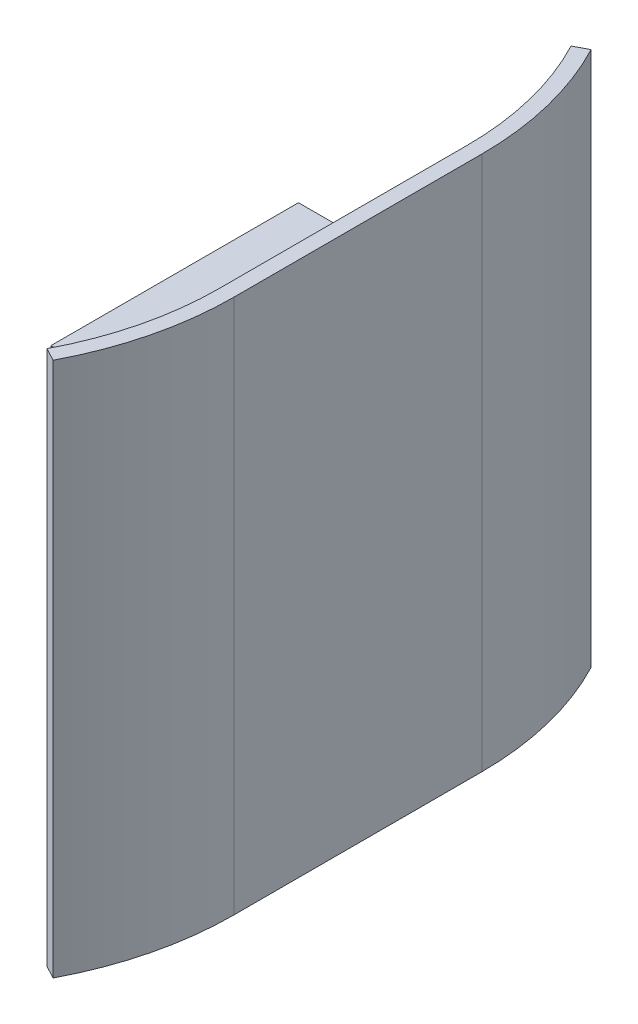
ISO-10303-21;
HEADER;
FILE_DESCRIPTION(('STEP AP214'),'2;1');
FILE_NAME('part.step','',(''),(''),'','','');
FILE_SCHEMA(('AUTOMOTIVE_DESIGN { 1 0 10303 214 1 1 1 1 }'));
ENDSEC;
DATA;
#1=APPLICATION_CONTEXT('core data for automotive mechanical design processes');
#2=APPLICATION_PROTOCOL_DEFINITION('international standard','automotive_design',2000,#1);
#3=PRODUCT_CONTEXT('',#1,'mechanical');
#4=PRODUCT('Part','Part','',(#3));
#5=PRODUCT_RELATED_PRODUCT_CATEGORY('part','',(#4));
#6=PRODUCT_DEFINITION_FORMATION('','',#4);
#7=PRODUCT_DEFINITION_CONTEXT('part definition',#1,'design');
#8=PRODUCT_DEFINITION('design','',#6,#7);
#9=PRODUCT_DEFINITION_SHAPE('','',#8);
#10=(LENGTH_UNIT() NAMED_UNIT(*) SI_UNIT(.MILLI.,.METRE.));
#11=(NAMED_UNIT(*) PLANE_ANGLE_UNIT() SI_UNIT($,.RADIAN.));
#12=(NAMED_UNIT(*) SI_UNIT($,.STERADIAN.) SOLID_ANGLE_UNIT());
#13=UNCERTAINTY_MEASURE_WITH_UNIT(LENGTH_MEASURE(1.E-05),#10,'distance_accuracy_value','');
#14=(GEOMETRIC_REPRESENTATION_CONTEXT(3) GLOBAL_UNCERTAINTY_ASSIGNED_CONTEXT((#13)) GLOBAL_UNIT_ASSIGNED_CONTEXT((#10,
#11,#12)) REPRESENTATION_CONTEXT('',''));
#15=CARTESIAN_POINT('',(0.,0.,0.));
#16=DIRECTION('',(0.,0.,1.));
#17=DIRECTION('',(1.,0.,0.));
#18=AXIS2_PLACEMENT_3D('',#15,#16,#17);
#19=CARTESIAN_POINT('',(0.,0.,50.));
#20=DIRECTION('',(0.,0.,1.));
#21=DIRECTION('',(1.,0.,0.));
#22=AXIS2_PLACEMENT_3D('',#19,#20,#21);
#23=PLANE('',#22);
#24=DIRECTION('',(0.,-1.,0.));
#25=VECTOR('',#24,1.);
#26=CARTESIAN_POINT('',(-2.,0.,50.));
#27=LINE('',#26,#25);
#28=CARTESIAN_POINT('',(-2.,52.,50.));
#29=VERTEX_POINT('',#28);
#30=CARTESIAN_POINT('',(-2.,-2.,50.));
#31=VERTEX_POINT('',#30);
#32=EDGE_CURVE('E310',#29,#31,#27,.T.);
#33=ORIENTED_EDGE('',*,*,#32,.T.);
#34=DIRECTION('',(1.,0.,0.));
#35=VECTOR('',#34,1.);
#36=CARTESIAN_POINT('',(0.,-2.,50.));
#37=LINE('',#36,#35);
#38=CARTESIAN_POINT('',(32.,-2.,50.));
#39=VERTEX_POINT('',#38);
#40=EDGE_CURVE('E313',#31,#39,#37,.T.);
#41=ORIENTED_EDGE('',*,*,#40,.T.);
#42=DIRECTION('',(0.,1.,0.));
#43=VECTOR('',#42,1.);
#44=CARTESIAN_POINT('',(32.,0.,50.));
#45=LINE('',#44,#43);
#46=CARTESIAN_POINT('',(32.,52.,50.));
#47=VERTEX_POINT('',#46);
#48=EDGE_CURVE('E180',#39,#47,#45,.T.);
#49=ORIENTED_EDGE('',*,*,#48,.T.);
#50=DIRECTION('',(-1.,0.,0.));
#51=VECTOR('',#50,1.);
#52=CARTESIAN_POINT('',(0.,52.,50.));
#53=LINE('',#52,#51);
#54=EDGE_CURVE('E317',#47,#29,#53,.T.);
#55=ORIENTED_EDGE('',*,*,#54,.T.);
#56=EDGE_LOOP('',(#33,#41,#49,#55));
#57=FACE_BOUND('',#56,.T.);
#58=DIRECTION('',(1.,0.,0.));
#59=VECTOR('',#58,1.);
#60=CARTESIAN_POINT('',(0.,0.,50.));
#61=LINE('',#60,#59);
#62=CARTESIAN_POINT('',(0.,0.,50.));
#63=VERTEX_POINT('',#62);
#64=CARTESIAN_POINT('',(30.,0.,50.));
#65=VERTEX_POINT('',#64);
#66=EDGE_CURVE('E286',#63,#65,#61,.T.);
#67=ORIENTED_EDGE('',*,*,#66,.F.);
#68=DIRECTION('',(0.,-1.,0.));
#69=VECTOR('',#68,1.);
#70=CARTESIAN_POINT('',(0.,0.,50.));
#71=LINE('',#70,#69);
#72=CARTESIAN_POINT('',(0.,50.,50.));
#73=VERTEX_POINT('',#72);
#74=EDGE_CURVE('E284',#73,#63,#71,.T.);
#75=ORIENTED_EDGE('',*,*,#74,.F.);
#76=DIRECTION('',(-1.,0.,0.));
#77=VECTOR('',#76,1.);
#78=CARTESIAN_POINT('',(0.,50.,50.));
#79=LINE('',#78,#77);
#80=CARTESIAN_POINT('',(30.,50.,50.));
#81=VERTEX_POINT('',#80);
#82=EDGE_CURVE('E291',#81,#73,#79,.T.);
#83=ORIENTED_EDGE('',*,*,#82,.F.);
#84=DIRECTION('',(0.,1.,0.));
#85=VECTOR('',#84,1.);
#86=CARTESIAN_POINT('',(30.,0.,50.));
#87=LINE('',#86,#85);
#88=EDGE_CURVE('E289',#65,#81,#87,.T.);
#89=ORIENTED_EDGE('',*,*,#88,.F.);
#90=EDGE_LOOP('',(#67,#75,#83,#89));
#91=FACE_BOUND('',#90,.T.);
#92=ADVANCED_FACE('F57',(#57,#91),#23,.T.);
#93=CARTESIAN_POINT('',(0.,0.,0.));
#94=DIRECTION('',(0.,0.,1.));
#95=DIRECTION('',(1.,0.,0.));
#96=AXIS2_PLACEMENT_3D('',#93,#94,#95);
#97=PLANE('',#96);
#98=DIRECTION('',(0.,-1.,0.));
#99=VECTOR('',#98,1.);
#100=CARTESIAN_POINT('',(-2.,0.,0.));
#101=LINE('',#100,#99);
#102=CARTESIAN_POINT('',(-2.,52.,0.));
#103=VERTEX_POINT('',#102);
#104=CARTESIAN_POINT('',(-2.,-2.,0.));
#105=VERTEX_POINT('',#104);
#106=EDGE_CURVE('E309',#103,#105,#101,.T.);
#107=ORIENTED_EDGE('',*,*,#106,.F.);
#108=DIRECTION('',(-1.,0.,0.));
#109=VECTOR('',#108,1.);
#110=CARTESIAN_POINT('',(0.,52.,0.));
#111=LINE('',#110,#109);
#112=CARTESIAN_POINT('',(32.,52.,0.));
#113=VERTEX_POINT('',#112);
#114=EDGE_CURVE('E314',#113,#103,#111,.T.);
#115=ORIENTED_EDGE('',*,*,#114,.F.);
#116=DIRECTION('',(0.,1.,0.));
#117=VECTOR('',#116,1.);
#118=CARTESIAN_POINT('',(32.,0.,0.));
#119=LINE('',#118,#117);
#120=CARTESIAN_POINT('',(32.,-2.,0.));
#121=VERTEX_POINT('',#120);
#122=EDGE_CURVE('E325',#121,#113,#119,.T.);
#123=ORIENTED_EDGE('',*,*,#122,.F.);
#124=DIRECTION('',(1.,0.,0.));
#125=VECTOR('',#124,1.);
#126=CARTESIAN_POINT('',(0.,-2.,0.));
#127=LINE('',#126,#125);
#128=EDGE_CURVE('E322',#105,#121,#127,.T.);
#129=ORIENTED_EDGE('',*,*,#128,.F.);
#130=EDGE_LOOP('',(#107,#115,#123,#129));
#131=FACE_BOUND('',#130,.T.);
#132=DIRECTION('',(0.,-1.,0.));
#133=VECTOR('',#132,1.);
#134=CARTESIAN_POINT('',(0.,0.,0.));
#135=LINE('',#134,#133);
#136=CARTESIAN_POINT('',(0.,50.,0.));
#137=VERTEX_POINT('',#136);
#138=CARTESIAN_POINT('',(0.,0.,0.));
#139=VERTEX_POINT('',#138);
#140=EDGE_CURVE('E80',#137,#139,#135,.T.);
#141=ORIENTED_EDGE('',*,*,#140,.T.);
#142=DIRECTION('',(1.,0.,0.));
#143=VECTOR('',#142,1.);
#144=CARTESIAN_POINT('',(0.,0.,0.));
#145=LINE('',#144,#143);
#146=CARTESIAN_POINT('',(30.,0.,0.));
#147=VERTEX_POINT('',#146);
#148=EDGE_CURVE('E295',#139,#147,#145,.T.);
#149=ORIENTED_EDGE('',*,*,#148,.T.);
#150=DIRECTION('',(0.,1.,0.));
#151=VECTOR('',#150,1.);
#152=CARTESIAN_POINT('',(30.,0.,0.));
#153=LINE('',#152,#151);
#154=CARTESIAN_POINT('',(30.,50.,0.));
#155=VERTEX_POINT('',#154);
#156=EDGE_CURVE('E298',#147,#155,#153,.T.);
#157=ORIENTED_EDGE('',*,*,#156,.T.);
#158=DIRECTION('',(-1.,0.,0.));
#159=VECTOR('',#158,1.);
#160=CARTESIAN_POINT('',(0.,50.,0.));
#161=LINE('',#160,#159);
#162=EDGE_CURVE('E287',#155,#137,#161,.T.);
#163=ORIENTED_EDGE('',*,*,#162,.T.);
#164=EDGE_LOOP('',(#141,#149,#157,#163));
#165=FACE_BOUND('',#164,.T.);
#166=ADVANCED_FACE('F344',(#131,#165),#97,.F.);
#167=CARTESIAN_POINT('',(-2.,0.,50.));
#168=DIRECTION('',(1.,0.,0.));
#169=DIRECTION('',(0.,0.,-1.));
#170=AXIS2_PLACEMENT_3D('',#167,#168,#169);
#171=PLANE('',#170);
#172=CARTESIAN_POINT('',(-2.,17.,25.));
#173=DIRECTION('',(-1.,0.,0.));
#174=DIRECTION('',(0.,0.,-1.));
#175=AXIS2_PLACEMENT_3D('',#172,#173,#174);
#176=CIRCLE('',#175,2.);
#177=CARTESIAN_POINT('',(-2.,17.,23.));
#178=VERTEX_POINT('',#177);
#179=EDGE_CURVE('E259',#178,#178,#176,.T.);
#180=ORIENTED_EDGE('',*,*,#179,.F.);
#181=EDGE_LOOP('',(#180));
#182=FACE_BOUND('',#181,.T.);
#183=CARTESIAN_POINT('',(-2.,33.,25.));
#184=DIRECTION('',(-1.,0.,0.));
#185=DIRECTION('',(0.,0.,1.));
#186=AXIS2_PLACEMENT_3D('',#183,#184,#185);
#187=CIRCLE('',#186,2.);
#188=CARTESIAN_POINT('',(-2.,33.,27.));
#189=VERTEX_POINT('',#188);
#190=EDGE_CURVE('E258',#189,#189,#187,.T.);
#191=ORIENTED_EDGE('',*,*,#190,.F.);
#192=EDGE_LOOP('',(#191));
#193=FACE_BOUND('',#192,.T.);
#194=CARTESIAN_POINT('',(-2.,25.,17.));
#195=DIRECTION('',(-1.,0.,0.));
#196=DIRECTION('',(0.,0.,-1.));
#197=AXIS2_PLACEMENT_3D('',#194,#195,#196);
#198=CIRCLE('',#197,2.);
#199=CARTESIAN_POINT('',(-2.,25.,15.));
#200=VERTEX_POINT('',#199);
#201=EDGE_CURVE('E271',#200,#200,#198,.T.);
#202=ORIENTED_EDGE('',*,*,#201,.F.);
#203=EDGE_LOOP('',(#202));
#204=FACE_BOUND('',#203,.T.);
#205=CARTESIAN_POINT('',(-2.,25.,33.));
#206=DIRECTION('',(-1.,0.,0.));
#207=DIRECTION('',(0.,0.,1.));
#208=AXIS2_PLACEMENT_3D('',#205,#206,#207);
#209=CIRCLE('',#208,2.);
#210=CARTESIAN_POINT('',(-2.,25.,35.));
#211=VERTEX_POINT('',#210);
#212=EDGE_CURVE('E270',#211,#211,#209,.T.);
#213=ORIENTED_EDGE('',*,*,#212,.F.);
#214=EDGE_LOOP('',(#213));
#215=FACE_BOUND('',#214,.T.);
#216=CARTESIAN_POINT('',(-2.,25.,25.));
#217=DIRECTION('',(-1.,0.,0.));
#218=DIRECTION('',(0.,0.,1.));
#219=AXIS2_PLACEMENT_3D('',#216,#217,#218);
#220=CIRCLE('',#219,4.);
#221=CARTESIAN_POINT('',(-2.,25.,29.));
#222=VERTEX_POINT('',#221);
#223=EDGE_CURVE('E281',#222,#222,#220,.T.);
#224=ORIENTED_EDGE('',*,*,#223,.F.);
#225=EDGE_LOOP('',(#224));
#226=FACE_BOUND('',#225,.T.);
#227=ORIENTED_EDGE('',*,*,#106,.T.);
#228=DIRECTION('',(0.,0.,-1.));
#229=VECTOR('',#228,1.);
#230=CARTESIAN_POINT('',(-2.,-2.,50.));
#231=LINE('',#230,#229);
#232=EDGE_CURVE('E12',#31,#105,#231,.T.);
#233=ORIENTED_EDGE('',*,*,#232,.F.);
#234=ORIENTED_EDGE('',*,*,#32,.F.);
#235=DIRECTION('',(0.,0.,-1.));
#236=VECTOR('',#235,1.);
#237=CARTESIAN_POINT('',(-2.,52.,50.));
#238=LINE('',#237,#236);
#239=EDGE_CURVE('E319',#29,#103,#238,.T.);
#240=ORIENTED_EDGE('',*,*,#239,.T.);
#241=EDGE_LOOP('',(#227,#233,#234,#240));
#242=FACE_BOUND('',#241,.T.);
#243=ADVANCED_FACE('F59',(#182,#193,#204,#215,#226,#242),#171,.F.);
#244=CARTESIAN_POINT('',(0.,-2.,50.));
#245=DIRECTION('',(0.,1.,0.));
#246=DIRECTION('',(0.,0.,1.));
#247=AXIS2_PLACEMENT_3D('',#244,#245,#246);
#248=PLANE('',#247);
#249=ORIENTED_EDGE('',*,*,#128,.T.);
#250=DIRECTION('',(0.,0.,-1.));
#251=VECTOR('',#250,1.);
#252=CARTESIAN_POINT('',(32.,-2.,50.));
#253=LINE('',#252,#251);
#254=EDGE_CURVE('E65',#39,#121,#253,.T.);
#255=ORIENTED_EDGE('',*,*,#254,.F.);
#256=ORIENTED_EDGE('',*,*,#40,.F.);
#257=ORIENTED_EDGE('',*,*,#232,.T.);
#258=EDGE_LOOP('',(#249,#255,#256,#257));
#259=FACE_BOUND('',#258,.T.);
#260=ADVANCED_FACE('F339',(#259),#248,.F.);
#261=CARTESIAN_POINT('',(0.,52.,50.));
#262=DIRECTION('',(0.,-1.,0.));
#263=DIRECTION('',(0.,0.,-1.));
#264=AXIS2_PLACEMENT_3D('',#261,#262,#263);
#265=PLANE('',#264);
#266=ORIENTED_EDGE('',*,*,#114,.T.);
#267=ORIENTED_EDGE('',*,*,#239,.F.);
#268=ORIENTED_EDGE('',*,*,#54,.F.);
#269=DIRECTION('',(0.,0.,-1.));
#270=VECTOR('',#269,1.);
#271=CARTESIAN_POINT('',(32.,52.,50.));
#272=LINE('',#271,#270);
#273=EDGE_CURVE('E330',#47,#113,#272,.T.);
#274=ORIENTED_EDGE('',*,*,#273,.T.);
#275=EDGE_LOOP('',(#266,#267,#268,#274));
#276=FACE_BOUND('',#275,.T.);
#277=ADVANCED_FACE('F348',(#276),#265,.F.);
#278=CARTESIAN_POINT('',(0.,0.,50.));
#279=DIRECTION('',(1.,0.,0.));
#280=DIRECTION('',(0.,0.,-1.));
#281=AXIS2_PLACEMENT_3D('',#278,#279,#280);
#282=PLANE('',#281);
#283=CARTESIAN_POINT('',(0.,17.,25.));
#284=DIRECTION('',(1.,0.,0.));
#285=DIRECTION('',(0.,0.,-1.));
#286=AXIS2_PLACEMENT_3D('',#283,#284,#285);
#287=CIRCLE('',#286,2.);
#288=CARTESIAN_POINT('',(0.,17.,23.));
#289=VERTEX_POINT('',#288);
#290=EDGE_CURVE('E237',#289,#289,#287,.F.);
#291=ORIENTED_EDGE('',*,*,#290,.T.);
#292=EDGE_LOOP('',(#291));
#293=FACE_BOUND('',#292,.T.);
#294=CARTESIAN_POINT('',(0.,33.,25.));
#295=DIRECTION('',(1.,0.,0.));
#296=DIRECTION('',(0.,0.,-1.));
#297=AXIS2_PLACEMENT_3D('',#294,#295,#296);
#298=CIRCLE('',#297,2.);
#299=CARTESIAN_POINT('',(0.,33.,23.));
#300=VERTEX_POINT('',#299);
#301=EDGE_CURVE('E255',#300,#300,#298,.F.);
#302=ORIENTED_EDGE('',*,*,#301,.T.);
#303=EDGE_LOOP('',(#302));
#304=FACE_BOUND('',#303,.T.);
#305=CARTESIAN_POINT('',(0.,25.,17.));
#306=DIRECTION('',(1.,0.,0.));
#307=DIRECTION('',(0.,0.,-1.));
#308=AXIS2_PLACEMENT_3D('',#305,#306,#307);
#309=CIRCLE('',#308,2.);
#310=CARTESIAN_POINT('',(0.,25.,15.));
#311=VERTEX_POINT('',#310);
#312=EDGE_CURVE('E262',#311,#311,#309,.F.);
#313=ORIENTED_EDGE('',*,*,#312,.T.);
#314=EDGE_LOOP('',(#313));
#315=FACE_BOUND('',#314,.T.);
#316=CARTESIAN_POINT('',(0.,25.,33.));
#317=DIRECTION('',(1.,0.,0.));
#318=DIRECTION('',(0.,0.,-1.));
#319=AXIS2_PLACEMENT_3D('',#316,#317,#318);
#320=CIRCLE('',#319,2.);
#321=CARTESIAN_POINT('',(0.,25.,31.));
#322=VERTEX_POINT('',#321);
#323=EDGE_CURVE('E267',#322,#322,#320,.F.);
#324=ORIENTED_EDGE('',*,*,#323,.T.);
#325=EDGE_LOOP('',(#324));
#326=FACE_BOUND('',#325,.T.);
#327=CARTESIAN_POINT('',(0.,25.,25.));
#328=DIRECTION('',(1.,0.,0.));
#329=DIRECTION('',(0.,0.,-1.));
#330=AXIS2_PLACEMENT_3D('',#327,#328,#329);
#331=CIRCLE('',#330,4.);
#332=CARTESIAN_POINT('',(0.,25.,21.));
#333=VERTEX_POINT('',#332);
#334=EDGE_CURVE('E274',#333,#333,#331,.F.);
#335=ORIENTED_EDGE('',*,*,#334,.T.);
#336=EDGE_LOOP('',(#335));
#337=FACE_BOUND('',#336,.T.);
#338=ORIENTED_EDGE('',*,*,#140,.F.);
#339=DIRECTION('',(0.,0.,-1.));
#340=VECTOR('',#339,1.);
#341=CARTESIAN_POINT('',(0.,50.,50.));
#342=LINE('',#341,#340);
#343=EDGE_CURVE('E293',#73,#137,#342,.T.);
#344=ORIENTED_EDGE('',*,*,#343,.F.);
#345=ORIENTED_EDGE('',*,*,#74,.T.);
#346=DIRECTION('',(0.,0.,-1.));
#347=VECTOR('',#346,1.);
#348=CARTESIAN_POINT('',(0.,0.,50.));
#349=LINE('',#348,#347);
#350=EDGE_CURVE('E307',#63,#139,#349,.T.);
#351=ORIENTED_EDGE('',*,*,#350,.T.);
#352=EDGE_LOOP('',(#338,#344,#345,#351));
#353=FACE_BOUND('',#352,.T.);
#354=ADVANCED_FACE('F395',(#293,#304,#315,#326,#337,#353),#282,.T.);
#355=CARTESIAN_POINT('',(0.,0.,50.));
#356=DIRECTION('',(0.,1.,0.));
#357=DIRECTION('',(0.,0.,1.));
#358=AXIS2_PLACEMENT_3D('',#355,#356,#357);
#359=PLANE('',#358);
#360=ORIENTED_EDGE('',*,*,#148,.F.);
#361=ORIENTED_EDGE('',*,*,#350,.F.);
#362=ORIENTED_EDGE('',*,*,#66,.T.);
#363=DIRECTION('',(0.,0.,-1.));
#364=VECTOR('',#363,1.);
#365=CARTESIAN_POINT('',(30.,0.,50.));
#366=LINE('',#365,#364);
#367=EDGE_CURVE('E305',#65,#147,#366,.T.);
#368=ORIENTED_EDGE('',*,*,#367,.T.);
#369=EDGE_LOOP('',(#360,#361,#362,#368));
#370=FACE_BOUND('',#369,.T.);
#371=ADVANCED_FACE('F435',(#370),#359,.T.);
#372=CARTESIAN_POINT('',(30.,0.,50.));
#373=DIRECTION('',(-1.,0.,0.));
#374=DIRECTION('',(0.,0.,1.));
#375=AXIS2_PLACEMENT_3D('',#372,#373,#374);
#376=PLANE('',#375);
#377=ORIENTED_EDGE('',*,*,#156,.F.);
#378=ORIENTED_EDGE('',*,*,#367,.F.);
#379=ORIENTED_EDGE('',*,*,#88,.T.);
#380=DIRECTION('',(0.,0.,-1.));
#381=VECTOR('',#380,1.);
#382=CARTESIAN_POINT('',(30.,50.,50.));
#383=LINE('',#382,#381);
#384=EDGE_CURVE('E72',#81,#155,#383,.T.);
#385=ORIENTED_EDGE('',*,*,#384,.T.);
#386=EDGE_LOOP('',(#377,#378,#379,#385));
#387=FACE_BOUND('',#386,.T.);
#388=ADVANCED_FACE('F429',(#387),#376,.T.);
#389=CARTESIAN_POINT('',(0.,50.,50.));
#390=DIRECTION('',(0.,-1.,0.));
#391=DIRECTION('',(0.,0.,-1.));
#392=AXIS2_PLACEMENT_3D('',#389,#390,#391);
#393=PLANE('',#392);
#394=ORIENTED_EDGE('',*,*,#162,.F.);
#395=ORIENTED_EDGE('',*,*,#384,.F.);
#396=ORIENTED_EDGE('',*,*,#82,.T.);
#397=ORIENTED_EDGE('',*,*,#343,.T.);
#398=EDGE_LOOP('',(#394,#395,#396,#397));
#399=FACE_BOUND('',#398,.T.);
#400=ADVANCED_FACE('F419',(#399),#393,.T.);
#401=CARTESIAN_POINT('',(32.001,25.,25.));
#402=DIRECTION('',(-1.,0.,0.));
#403=DIRECTION('',(0.,0.,1.));
#404=AXIS2_PLACEMENT_3D('',#401,#402,#403);
#405=CYLINDRICAL_SURFACE('',#404,4.);
#406=ORIENTED_EDGE('',*,*,#334,.F.);
#407=EDGE_LOOP('',(#406));
#408=FACE_BOUND('',#407,.T.);
#409=ORIENTED_EDGE('',*,*,#223,.T.);
#410=EDGE_LOOP('',(#409));
#411=FACE_BOUND('',#410,.T.);
#412=ADVANCED_FACE('F416',(#408,#411),#405,.F.);
#413=CARTESIAN_POINT('',(32.001,25.,33.));
#414=DIRECTION('',(-1.,0.,0.));
#415=DIRECTION('',(0.,0.,1.));
#416=AXIS2_PLACEMENT_3D('',#413,#414,#415);
#417=CYLINDRICAL_SURFACE('',#416,2.);
#418=ORIENTED_EDGE('',*,*,#323,.F.);
#419=EDGE_LOOP('',(#418));
#420=FACE_BOUND('',#419,.T.);
#421=ORIENTED_EDGE('',*,*,#212,.T.);
#422=EDGE_LOOP('',(#421));
#423=FACE_BOUND('',#422,.T.);
#424=ADVANCED_FACE('F418',(#420,#423),#417,.F.);
#425=CARTESIAN_POINT('',(32.001,25.,17.));
#426=DIRECTION('',(-1.,0.,0.));
#427=DIRECTION('',(0.,0.,1.));
#428=AXIS2_PLACEMENT_3D('',#425,#426,#427);
#429=CYLINDRICAL_SURFACE('',#428,2.);
#430=ORIENTED_EDGE('',*,*,#312,.F.);
#431=EDGE_LOOP('',(#430));
#432=FACE_BOUND('',#431,.T.);
#433=ORIENTED_EDGE('',*,*,#201,.T.);
#434=EDGE_LOOP('',(#433));
#435=FACE_BOUND('',#434,.T.);
#436=ADVANCED_FACE('F426',(#432,#435),#429,.F.);
#437=CARTESIAN_POINT('',(32.001,33.,25.));
#438=DIRECTION('',(-1.,0.,0.));
#439=DIRECTION('',(0.,0.,1.));
#440=AXIS2_PLACEMENT_3D('',#437,#438,#439);
#441=CYLINDRICAL_SURFACE('',#440,2.);
#442=ORIENTED_EDGE('',*,*,#301,.F.);
#443=EDGE_LOOP('',(#442));
#444=FACE_BOUND('',#443,.T.);
#445=ORIENTED_EDGE('',*,*,#190,.T.);
#446=EDGE_LOOP('',(#445));
#447=FACE_BOUND('',#446,.T.);
#448=ADVANCED_FACE('F464',(#444,#447),#441,.F.);
#449=CARTESIAN_POINT('',(32.001,17.,25.));
#450=DIRECTION('',(-1.,0.,0.));
#451=DIRECTION('',(0.,0.,1.));
#452=AXIS2_PLACEMENT_3D('',#449,#450,#451);
#453=CYLINDRICAL_SURFACE('',#452,2.);
#454=ORIENTED_EDGE('',*,*,#290,.F.);
#455=EDGE_LOOP('',(#454));
#456=FACE_BOUND('',#455,.T.);
#457=ORIENTED_EDGE('',*,*,#179,.T.);
#458=EDGE_LOOP('',(#457));
#459=FACE_BOUND('',#458,.T.);
#460=ADVANCED_FACE('F468',(#456,#459),#453,.F.);
#461=CARTESIAN_POINT('',(32.,25.,50.));
#462=DIRECTION('',(-1.,0.,0.));
#463=DIRECTION('',(0.,0.,1.));
#464=AXIS2_PLACEMENT_3D('',#461,#462,#463);
#465=PLANE('',#464);
#466=ORIENTED_EDGE('',*,*,#273,.F.);
#467=DIRECTION('',(0.,1.,0.));
#468=VECTOR('',#467,1.);
#469=CARTESIAN_POINT('',(32.,25.,50.));
#470=LINE('',#469,#468);
#471=CARTESIAN_POINT('',(32.,79.,50.));
#472=VERTEX_POINT('',#471);
#473=EDGE_CURVE('E235',#47,#472,#470,.T.);
#474=ORIENTED_EDGE('',*,*,#473,.T.);
#475=DIRECTION('',(0.,0.,1.));
#476=VECTOR('',#475,1.);
#477=CARTESIAN_POINT('',(32.,79.,50.));
#478=LINE('',#477,#476);
#479=CARTESIAN_POINT('',(32.,79.,0.));
#480=VERTEX_POINT('',#479);
#481=EDGE_CURVE('E231',#480,#472,#478,.T.);
#482=ORIENTED_EDGE('',*,*,#481,.F.);
#483=DIRECTION('',(0.,1.,0.));
#484=VECTOR('',#483,1.);
#485=CARTESIAN_POINT('',(32.,25.,0.));
#486=LINE('',#485,#484);
#487=EDGE_CURVE('E238',#113,#480,#486,.T.);
#488=ORIENTED_EDGE('',*,*,#487,.F.);
#489=EDGE_LOOP('',(#466,#474,#482,#488));
#490=FACE_BOUND('',#489,.T.);
#491=ADVANCED_FACE('F356',(#490),#465,.T.);
#492=CARTESIAN_POINT('',(-28.,25.,50.));
#493=DIRECTION('',(0.,1.,0.));
#494=DIRECTION('',(0.,0.,1.));
#495=AXIS2_PLACEMENT_3D('',#492,#493,#494);
#496=CYLINDRICAL_SURFACE('',#495,60.);
#497=CARTESIAN_POINT('',(-28.,79.,50.));
#498=DIRECTION('',(0.,-1.,0.));
#499=DIRECTION('',(0.,0.,-1.));
#500=AXIS2_PLACEMENT_3D('',#497,#498,#499);
#501=CIRCLE('',#500,60.);
#502=CARTESIAN_POINT('',(25.1181643379453,79.,77.9009071065269));
#503=VERTEX_POINT('',#502);
#504=EDGE_CURVE('E213',#472,#503,#501,.T.);
#505=ORIENTED_EDGE('',*,*,#504,.F.);
#506=ORIENTED_EDGE('',*,*,#473,.F.);
#507=ORIENTED_EDGE('',*,*,#48,.F.);
#508=DIRECTION('',(0.,-1.,0.));
#509=VECTOR('',#508,1.);
#510=CARTESIAN_POINT('',(32.,25.,50.));
#511=LINE('',#510,#509);
#512=CARTESIAN_POINT('',(32.,-29.,50.));
#513=VERTEX_POINT('',#512);
#514=EDGE_CURVE('E172',#39,#513,#511,.T.);
#515=ORIENTED_EDGE('',*,*,#514,.T.);
#516=CARTESIAN_POINT('',(-28.,-29.,50.));
#517=DIRECTION('',(0.,-1.,0.));
#518=DIRECTION('',(0.,0.,-1.));
#519=AXIS2_PLACEMENT_3D('',#516,#517,#518);
#520=CIRCLE('',#519,60.);
#521=CARTESIAN_POINT('',(25.1181643379453,-29.,77.9009071065269));
#522=VERTEX_POINT('',#521);
#523=EDGE_CURVE('E177',#513,#522,#520,.T.);
#524=ORIENTED_EDGE('',*,*,#523,.T.);
#525=DIRECTION('',(0.,1.,0.));
#526=VECTOR('',#525,1.);
#527=CARTESIAN_POINT('',(25.1181643379453,25.,77.9009071065269));
#528=LINE('',#527,#526);
#529=EDGE_CURVE('E234',#522,#503,#528,.T.);
#530=ORIENTED_EDGE('',*,*,#529,.T.);
#531=EDGE_LOOP('',(#505,#506,#507,#515,#524,#530));
#532=FACE_BOUND('',#531,.T.);
#533=ADVANCED_FACE('F175',(#532),#496,.F.);
#534=CARTESIAN_POINT('',(-28.,25.,0.));
#535=DIRECTION('',(0.,1.,0.));
#536=DIRECTION('',(0.,0.,1.));
#537=AXIS2_PLACEMENT_3D('',#534,#535,#536);
#538=CYLINDRICAL_SURFACE('',#537,60.);
#539=CARTESIAN_POINT('',(-28.,79.,0.));
#540=DIRECTION('',(0.,-1.,0.));
#541=DIRECTION('',(0.,0.,1.));
#542=AXIS2_PLACEMENT_3D('',#539,#540,#541);
#543=CIRCLE('',#542,60.);
#544=CARTESIAN_POINT('',(25.1181643379453,79.,-27.9009071065269));
#545=VERTEX_POINT('',#544);
#546=EDGE_CURVE('E228',#545,#480,#543,.T.);
#547=ORIENTED_EDGE('',*,*,#546,.F.);
#548=DIRECTION('',(0.,1.,0.));
#549=VECTOR('',#548,1.);
#550=CARTESIAN_POINT('',(25.1181643379453,25.,-27.9009071065269));
#551=LINE('',#550,#549);
#552=CARTESIAN_POINT('',(25.1181643379453,-29.,-27.9009071065269));
#553=VERTEX_POINT('',#552);
#554=EDGE_CURVE('E240',#553,#545,#551,.T.);
#555=ORIENTED_EDGE('',*,*,#554,.F.);
#556=CARTESIAN_POINT('',(-28.,-29.,0.));
#557=DIRECTION('',(0.,-1.,0.));
#558=DIRECTION('',(0.,0.,1.));
#559=AXIS2_PLACEMENT_3D('',#556,#557,#558);
#560=CIRCLE('',#559,60.);
#561=CARTESIAN_POINT('',(32.,-29.,0.));
#562=VERTEX_POINT('',#561);
#563=EDGE_CURVE('E193',#553,#562,#560,.T.);
#564=ORIENTED_EDGE('',*,*,#563,.T.);
#565=DIRECTION('',(0.,-1.,0.));
#566=VECTOR('',#565,1.);
#567=CARTESIAN_POINT('',(32.,25.,0.));
#568=LINE('',#567,#566);
#569=EDGE_CURVE('E183',#121,#562,#568,.T.);
#570=ORIENTED_EDGE('',*,*,#569,.F.);
#571=ORIENTED_EDGE('',*,*,#122,.T.);
#572=ORIENTED_EDGE('',*,*,#487,.T.);
#573=EDGE_LOOP('',(#547,#555,#564,#570,#571,#572));
#574=FACE_BOUND('',#573,.T.);
#575=ADVANCED_FACE('F336',(#574),#538,.F.);
#576=CARTESIAN_POINT('',(25.1181643379453,25.,-27.9009071065269));
#577=DIRECTION('',(0.465015118442115,0.,0.885302738965754));
#578=DIRECTION('',(0.885302738965754,0.,-0.465015118442115));
#579=AXIS2_PLACEMENT_3D('',#576,#577,#578);
#580=PLANE('',#579);
#581=DIRECTION('',(0.885302738965754,0.,-0.465015118442115));
#582=VECTOR('',#581,1.);
#583=CARTESIAN_POINT('',(25.1181643379453,79.,-27.9009071065269));
#584=LINE('',#583,#582);
#585=CARTESIAN_POINT('',(27.7740725548425,79.,-29.2959524618532));
#586=VERTEX_POINT('',#585);
#587=EDGE_CURVE('E226',#545,#586,#584,.T.);
#588=ORIENTED_EDGE('',*,*,#587,.T.);
#589=DIRECTION('',(0.,1.,0.));
#590=VECTOR('',#589,1.);
#591=CARTESIAN_POINT('',(27.7740725548425,25.,-29.2959524618532));
#592=LINE('',#591,#590);
#593=CARTESIAN_POINT('',(27.7740725548425,-29.,-29.2959524618532));
#594=VERTEX_POINT('',#593);
#595=EDGE_CURVE('E242',#594,#586,#592,.T.);
#596=ORIENTED_EDGE('',*,*,#595,.F.);
#597=DIRECTION('',(0.885302738965754,0.,-0.465015118442115));
#598=VECTOR('',#597,1.);
#599=CARTESIAN_POINT('',(25.1181643379453,-29.,-27.9009071065269));
#600=LINE('',#599,#598);
#601=EDGE_CURVE('E201',#553,#594,#600,.T.);
#602=ORIENTED_EDGE('',*,*,#601,.F.);
#603=ORIENTED_EDGE('',*,*,#554,.T.);
#604=EDGE_LOOP('',(#588,#596,#602,#603));
#605=FACE_BOUND('',#604,.T.);
#606=ADVANCED_FACE('F365',(#605),#580,.F.);
#607=CARTESIAN_POINT('',(-28.,25.,0.));
#608=DIRECTION('',(0.,1.,0.));
#609=DIRECTION('',(0.,0.,1.));
#610=AXIS2_PLACEMENT_3D('',#607,#608,#609);
#611=CYLINDRICAL_SURFACE('',#610,63.);
#612=CARTESIAN_POINT('',(-28.,79.,0.));
#613=DIRECTION('',(0.,1.,0.));
#614=DIRECTION('',(1.,0.,0.));
#615=AXIS2_PLACEMENT_3D('',#612,#613,#614);
#616=CIRCLE('',#615,63.);
#617=CARTESIAN_POINT('',(35.,79.,0.));
#618=VERTEX_POINT('',#617);
#619=EDGE_CURVE('E224',#586,#618,#616,.F.);
#620=ORIENTED_EDGE('',*,*,#619,.T.);
#621=DIRECTION('',(0.,1.,0.));
#622=VECTOR('',#621,1.);
#623=CARTESIAN_POINT('',(35.,25.,0.));
#624=LINE('',#623,#622);
#625=CARTESIAN_POINT('',(35.,-29.,0.));
#626=VERTEX_POINT('',#625);
#627=EDGE_CURVE('E245',#626,#618,#624,.T.);
#628=ORIENTED_EDGE('',*,*,#627,.F.);
#629=CARTESIAN_POINT('',(-28.,-29.,0.));
#630=DIRECTION('',(0.,1.,0.));
#631=DIRECTION('',(1.,0.,0.));
#632=AXIS2_PLACEMENT_3D('',#629,#630,#631);
#633=CIRCLE('',#632,63.);
#634=EDGE_CURVE('E204',#594,#626,#633,.F.);
#635=ORIENTED_EDGE('',*,*,#634,.F.);
#636=ORIENTED_EDGE('',*,*,#595,.T.);
#637=EDGE_LOOP('',(#620,#628,#635,#636));
#638=FACE_BOUND('',#637,.T.);
#639=ADVANCED_FACE('F368',(#638),#611,.T.);
#640=CARTESIAN_POINT('',(35.,25.,50.));
#641=DIRECTION('',(-1.,0.,0.));
#642=DIRECTION('',(0.,0.,1.));
#643=AXIS2_PLACEMENT_3D('',#640,#641,#642);
#644=PLANE('',#643);
#645=DIRECTION('',(0.,0.,-1.));
#646=VECTOR('',#645,1.);
#647=CARTESIAN_POINT('',(35.,79.,50.));
#648=LINE('',#647,#646);
#649=CARTESIAN_POINT('',(35.,79.,50.));
#650=VERTEX_POINT('',#649);
#651=EDGE_CURVE('E222',#618,#650,#648,.F.);
#652=ORIENTED_EDGE('',*,*,#651,.T.);
#653=DIRECTION('',(0.,1.,0.));
#654=VECTOR('',#653,1.);
#655=CARTESIAN_POINT('',(35.,25.,50.));
#656=LINE('',#655,#654);
#657=CARTESIAN_POINT('',(35.,-29.,50.));
#658=VERTEX_POINT('',#657);
#659=EDGE_CURVE('E248',#658,#650,#656,.T.);
#660=ORIENTED_EDGE('',*,*,#659,.F.);
#661=DIRECTION('',(0.,0.,-1.));
#662=VECTOR('',#661,1.);
#663=CARTESIAN_POINT('',(35.,-29.,50.));
#664=LINE('',#663,#662);
#665=EDGE_CURVE('E207',#626,#658,#664,.F.);
#666=ORIENTED_EDGE('',*,*,#665,.F.);
#667=ORIENTED_EDGE('',*,*,#627,.T.);
#668=EDGE_LOOP('',(#652,#660,#666,#667));
#669=FACE_BOUND('',#668,.T.);
#670=ADVANCED_FACE('F372',(#669),#644,.F.);
#671=CARTESIAN_POINT('',(-28.,25.,50.));
#672=DIRECTION('',(0.,1.,0.));
#673=DIRECTION('',(0.,0.,1.));
#674=AXIS2_PLACEMENT_3D('',#671,#672,#673);
#675=CYLINDRICAL_SURFACE('',#674,63.);
#676=CARTESIAN_POINT('',(-28.,79.,50.));
#677=DIRECTION('',(0.,1.,0.));
#678=DIRECTION('',(1.,0.,0.));
#679=AXIS2_PLACEMENT_3D('',#676,#677,#678);
#680=CIRCLE('',#679,63.);
#681=CARTESIAN_POINT('',(27.7740725548425,79.,79.2959524618532));
#682=VERTEX_POINT('',#681);
#683=EDGE_CURVE('E220',#650,#682,#680,.F.);
#684=ORIENTED_EDGE('',*,*,#683,.T.);
#685=DIRECTION('',(0.,1.,0.));
#686=VECTOR('',#685,1.);
#687=CARTESIAN_POINT('',(27.7740725548425,25.,79.2959524618532));
#688=LINE('',#687,#686);
#689=CARTESIAN_POINT('',(27.7740725548425,-29.,79.2959524618532));
#690=VERTEX_POINT('',#689);
#691=EDGE_CURVE('E251',#690,#682,#688,.T.);
#692=ORIENTED_EDGE('',*,*,#691,.F.);
#693=CARTESIAN_POINT('',(-28.,-29.,50.));
#694=DIRECTION('',(0.,1.,0.));
#695=DIRECTION('',(1.,0.,0.));
#696=AXIS2_PLACEMENT_3D('',#693,#694,#695);
#697=CIRCLE('',#696,63.);
#698=EDGE_CURVE('E210',#658,#690,#697,.F.);
#699=ORIENTED_EDGE('',*,*,#698,.F.);
#700=ORIENTED_EDGE('',*,*,#659,.T.);
#701=EDGE_LOOP('',(#684,#692,#699,#700));
#702=FACE_BOUND('',#701,.T.);
#703=ADVANCED_FACE('F376',(#702),#675,.T.);
#704=CARTESIAN_POINT('',(27.7740725548425,25.,79.2959524618532));
#705=DIRECTION('',(0.465015118442122,0.,-0.885302738965751));
#706=DIRECTION('',(-0.885302738965751,0.,-0.465015118442122));
#707=AXIS2_PLACEMENT_3D('',#704,#705,#706);
#708=PLANE('',#707);
#709=DIRECTION('',(-0.88530273896575,0.,-0.465015118442121));
#710=VECTOR('',#709,1.);
#711=CARTESIAN_POINT('',(27.7740725548425,79.,79.2959524618532));
#712=LINE('',#711,#710);
#713=EDGE_CURVE('E217',#682,#503,#712,.T.);
#714=ORIENTED_EDGE('',*,*,#713,.T.);
#715=ORIENTED_EDGE('',*,*,#529,.F.);
#716=DIRECTION('',(-0.88530273896575,0.,-0.465015118442121));
#717=VECTOR('',#716,1.);
#718=CARTESIAN_POINT('',(27.7740725548425,-29.,79.2959524618532));
#719=LINE('',#718,#717);
#720=EDGE_CURVE('E184',#690,#522,#719,.T.);
#721=ORIENTED_EDGE('',*,*,#720,.F.);
#722=ORIENTED_EDGE('',*,*,#691,.T.);
#723=EDGE_LOOP('',(#714,#715,#721,#722));
#724=FACE_BOUND('',#723,.T.);
#725=ADVANCED_FACE('F378',(#724),#708,.F.);
#726=CARTESIAN_POINT('',(-28.,79.,50.));
#727=DIRECTION('',(0.,-1.,0.));
#728=DIRECTION('',(-1.,0.,0.));
#729=AXIS2_PLACEMENT_3D('',#726,#727,#728);
#730=PLANE('',#729);
#731=ORIENTED_EDGE('',*,*,#504,.T.);
#732=ORIENTED_EDGE('',*,*,#713,.F.);
#733=ORIENTED_EDGE('',*,*,#683,.F.);
#734=ORIENTED_EDGE('',*,*,#651,.F.);
#735=ORIENTED_EDGE('',*,*,#619,.F.);
#736=ORIENTED_EDGE('',*,*,#587,.F.);
#737=ORIENTED_EDGE('',*,*,#546,.T.);
#738=ORIENTED_EDGE('',*,*,#481,.T.);
#739=EDGE_LOOP('',(#731,#732,#733,#734,#735,#736,#737,#738));
#740=FACE_BOUND('',#739,.T.);
#741=ADVANCED_FACE('F360',(#740),#730,.F.);
#742=CARTESIAN_POINT('',(32.,25.,50.));
#743=DIRECTION('',(1.,0.,0.));
#744=DIRECTION('',(0.,0.,-1.));
#745=AXIS2_PLACEMENT_3D('',#742,#743,#744);
#746=PLANE('',#745);
#747=ORIENTED_EDGE('',*,*,#514,.F.);
#748=ORIENTED_EDGE('',*,*,#254,.T.);
#749=ORIENTED_EDGE('',*,*,#569,.T.);
#750=DIRECTION('',(0.,0.,1.));
#751=VECTOR('',#750,1.);
#752=CARTESIAN_POINT('',(32.,-29.,50.));
#753=LINE('',#752,#751);
#754=EDGE_CURVE('E187',#562,#513,#753,.T.);
#755=ORIENTED_EDGE('',*,*,#754,.T.);
#756=EDGE_LOOP('',(#747,#748,#749,#755));
#757=FACE_BOUND('',#756,.T.);
#758=ADVANCED_FACE('F188',(#757),#746,.F.);
#759=CARTESIAN_POINT('',(-28.,-29.,50.));
#760=DIRECTION('',(0.,1.,0.));
#761=DIRECTION('',(-1.,0.,0.));
#762=AXIS2_PLACEMENT_3D('',#759,#760,#761);
#763=PLANE('',#762);
#764=ORIENTED_EDGE('',*,*,#523,.F.);
#765=ORIENTED_EDGE('',*,*,#754,.F.);
#766=ORIENTED_EDGE('',*,*,#563,.F.);
#767=ORIENTED_EDGE('',*,*,#601,.T.);
#768=ORIENTED_EDGE('',*,*,#634,.T.);
#769=ORIENTED_EDGE('',*,*,#665,.T.);
#770=ORIENTED_EDGE('',*,*,#698,.T.);
#771=ORIENTED_EDGE('',*,*,#720,.T.);
#772=EDGE_LOOP('',(#764,#765,#766,#767,#768,#769,#770,#771));
#773=FACE_BOUND('',#772,.T.);
#774=ADVANCED_FACE('F195',(#773),#763,.F.);
#775=CLOSED_SHELL('',(#92,#166,#243,#260,#277,#354,#371,#388,#400,#412,#424,#436,#448,#460,#491,
#533,#575,#606,#639,#670,#703,#725,#741,#758,#774));
#776=MANIFOLD_SOLID_BREP('B2',#775);
#777=ADVANCED_BREP_SHAPE_REPRESENTATION('',(#18,#776),#14);
#778=SHAPE_DEFINITION_REPRESENTATION(#9,#777);
ENDSEC;
END-ISO-10303-21;
